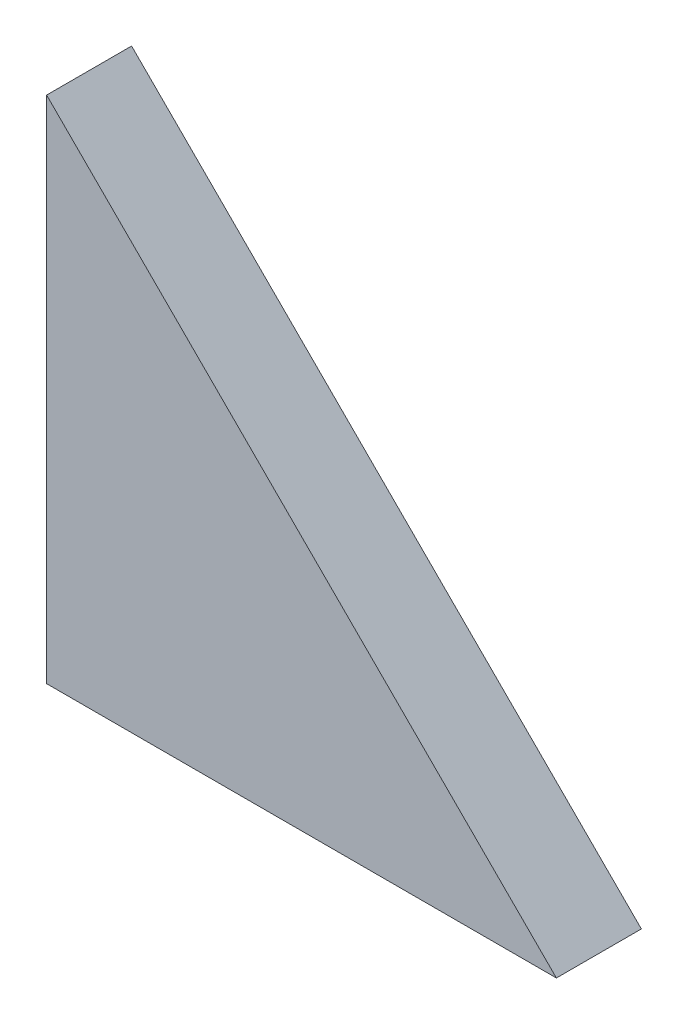
ISO-10303-21;
HEADER;
FILE_DESCRIPTION(('STEP AP214'),'2;1');
FILE_NAME('part.step','',(''),(''),'','','');
FILE_SCHEMA(('AUTOMOTIVE_DESIGN { 1 0 10303 214 1 1 1 1 }'));
ENDSEC;
DATA;
#1=APPLICATION_CONTEXT('core data for automotive mechanical design processes');
#2=APPLICATION_PROTOCOL_DEFINITION('international standard','automotive_design',2000,#1);
#3=PRODUCT_CONTEXT('',#1,'mechanical');
#4=PRODUCT('Part','Part','',(#3));
#5=PRODUCT_RELATED_PRODUCT_CATEGORY('part','',(#4));
#6=PRODUCT_DEFINITION_FORMATION('','',#4);
#7=PRODUCT_DEFINITION_CONTEXT('part definition',#1,'design');
#8=PRODUCT_DEFINITION('design','',#6,#7);
#9=PRODUCT_DEFINITION_SHAPE('','',#8);
#10=(LENGTH_UNIT() NAMED_UNIT(*) SI_UNIT(.MILLI.,.METRE.));
#11=(NAMED_UNIT(*) PLANE_ANGLE_UNIT() SI_UNIT($,.RADIAN.));
#12=(NAMED_UNIT(*) SI_UNIT($,.STERADIAN.) SOLID_ANGLE_UNIT());
#13=UNCERTAINTY_MEASURE_WITH_UNIT(LENGTH_MEASURE(1.E-05),#10,'distance_accuracy_value','');
#14=(GEOMETRIC_REPRESENTATION_CONTEXT(3) GLOBAL_UNCERTAINTY_ASSIGNED_CONTEXT((#13)) GLOBAL_UNIT_ASSIGNED_CONTEXT((#10,
#11,#12)) REPRESENTATION_CONTEXT('',''));
#15=CARTESIAN_POINT('',(0.,0.,0.));
#16=DIRECTION('',(0.,0.,1.));
#17=DIRECTION('',(1.,0.,0.));
#18=AXIS2_PLACEMENT_3D('',#15,#16,#17);
#19=CARTESIAN_POINT('',(0.,0.,10.));
#20=DIRECTION('',(1.,0.,0.));
#21=DIRECTION('',(0.,0.,-1.));
#22=AXIS2_PLACEMENT_3D('',#19,#20,#21);
#23=PLANE('',#22);
#24=DIRECTION('',(0.,-1.,0.));
#25=VECTOR('',#24,1.);
#26=CARTESIAN_POINT('',(0.,0.,0.));
#27=LINE('',#26,#25);
#28=CARTESIAN_POINT('',(0.,60.,0.));
#29=VERTEX_POINT('',#28);
#30=CARTESIAN_POINT('',(0.,0.,0.));
#31=VERTEX_POINT('',#30);
#32=EDGE_CURVE('E83',#29,#31,#27,.T.);
#33=ORIENTED_EDGE('',*,*,#32,.T.);
#34=DIRECTION('',(0.,0.,-1.));
#35=VECTOR('',#34,1.);
#36=CARTESIAN_POINT('',(0.,0.,10.));
#37=LINE('',#36,#35);
#38=CARTESIAN_POINT('',(0.,0.,10.));
#39=VERTEX_POINT('',#38);
#40=EDGE_CURVE('E11',#39,#31,#37,.T.);
#41=ORIENTED_EDGE('',*,*,#40,.F.);
#42=DIRECTION('',(0.,-1.,0.));
#43=VECTOR('',#42,1.);
#44=CARTESIAN_POINT('',(0.,0.,10.));
#45=LINE('',#44,#43);
#46=CARTESIAN_POINT('',(0.,60.,10.));
#47=VERTEX_POINT('',#46);
#48=EDGE_CURVE('E76',#47,#39,#45,.T.);
#49=ORIENTED_EDGE('',*,*,#48,.F.);
#50=DIRECTION('',(0.,0.,-1.));
#51=VECTOR('',#50,1.);
#52=CARTESIAN_POINT('',(0.,60.,10.));
#53=LINE('',#52,#51);
#54=EDGE_CURVE('E84',#47,#29,#53,.T.);
#55=ORIENTED_EDGE('',*,*,#54,.T.);
#56=EDGE_LOOP('',(#33,#41,#49,#55));
#57=FACE_BOUND('',#56,.T.);
#58=ADVANCED_FACE('F36',(#57),#23,.F.);
#59=CARTESIAN_POINT('',(0.,0.,10.));
#60=DIRECTION('',(0.,1.,0.));
#61=DIRECTION('',(0.,0.,1.));
#62=AXIS2_PLACEMENT_3D('',#59,#60,#61);
#63=PLANE('',#62);
#64=DIRECTION('',(1.,0.,0.));
#65=VECTOR('',#64,1.);
#66=CARTESIAN_POINT('',(0.,0.,0.));
#67=LINE('',#66,#65);
#68=CARTESIAN_POINT('',(60.,0.,0.));
#69=VERTEX_POINT('',#68);
#70=EDGE_CURVE('E64',#31,#69,#67,.T.);
#71=ORIENTED_EDGE('',*,*,#70,.T.);
#72=DIRECTION('',(0.,0.,-1.));
#73=VECTOR('',#72,1.);
#74=CARTESIAN_POINT('',(60.,0.,10.));
#75=LINE('',#74,#73);
#76=CARTESIAN_POINT('',(60.,0.,10.));
#77=VERTEX_POINT('',#76);
#78=EDGE_CURVE('E44',#77,#69,#75,.T.);
#79=ORIENTED_EDGE('',*,*,#78,.F.);
#80=DIRECTION('',(1.,0.,0.));
#81=VECTOR('',#80,1.);
#82=CARTESIAN_POINT('',(0.,0.,10.));
#83=LINE('',#82,#81);
#84=EDGE_CURVE('E72',#39,#77,#83,.T.);
#85=ORIENTED_EDGE('',*,*,#84,.F.);
#86=ORIENTED_EDGE('',*,*,#40,.T.);
#87=EDGE_LOOP('',(#71,#79,#85,#86));
#88=FACE_BOUND('',#87,.T.);
#89=ADVANCED_FACE('F73',(#88),#63,.F.);
#90=CARTESIAN_POINT('',(0.,60.,10.));
#91=DIRECTION('',(-0.707106781186548,-0.707106781186548,0.));
#92=DIRECTION('',(0.707106781186548,-0.707106781186548,0.));
#93=AXIS2_PLACEMENT_3D('',#90,#91,#92);
#94=PLANE('',#93);
#95=DIRECTION('',(-0.707106781186547,0.707106781186547,0.));
#96=VECTOR('',#95,1.);
#97=CARTESIAN_POINT('',(0.,60.,0.));
#98=LINE('',#97,#96);
#99=EDGE_CURVE('E69',#69,#29,#98,.T.);
#100=ORIENTED_EDGE('',*,*,#99,.T.);
#101=ORIENTED_EDGE('',*,*,#54,.F.);
#102=DIRECTION('',(-0.707106781186547,0.707106781186547,0.));
#103=VECTOR('',#102,1.);
#104=CARTESIAN_POINT('',(0.,60.,10.));
#105=LINE('',#104,#103);
#106=EDGE_CURVE('E52',#77,#47,#105,.T.);
#107=ORIENTED_EDGE('',*,*,#106,.F.);
#108=ORIENTED_EDGE('',*,*,#78,.T.);
#109=EDGE_LOOP('',(#100,#101,#107,#108));
#110=FACE_BOUND('',#109,.T.);
#111=ADVANCED_FACE('F91',(#110),#94,.F.);
#112=CARTESIAN_POINT('',(0.,0.,10.));
#113=DIRECTION('',(0.,0.,-1.));
#114=DIRECTION('',(-1.,0.,0.));
#115=AXIS2_PLACEMENT_3D('',#112,#113,#114);
#116=PLANE('',#115);
#117=ORIENTED_EDGE('',*,*,#48,.T.);
#118=ORIENTED_EDGE('',*,*,#84,.T.);
#119=ORIENTED_EDGE('',*,*,#106,.T.);
#120=EDGE_LOOP('',(#117,#118,#119));
#121=FACE_BOUND('',#120,.T.);
#122=ADVANCED_FACE('F79',(#121),#116,.F.);
#123=CARTESIAN_POINT('',(0.,0.,0.));
#124=DIRECTION('',(0.,0.,-1.));
#125=DIRECTION('',(-1.,0.,0.));
#126=AXIS2_PLACEMENT_3D('',#123,#124,#125);
#127=PLANE('',#126);
#128=ORIENTED_EDGE('',*,*,#32,.F.);
#129=ORIENTED_EDGE('',*,*,#99,.F.);
#130=ORIENTED_EDGE('',*,*,#70,.F.);
#131=EDGE_LOOP('',(#128,#129,#130));
#132=FACE_BOUND('',#131,.T.);
#133=ADVANCED_FACE('F92',(#132),#127,.T.);
#134=CLOSED_SHELL('',(#58,#89,#111,#122,#133));
#135=MANIFOLD_SOLID_BREP('B2',#134);
#136=ADVANCED_BREP_SHAPE_REPRESENTATION('',(#18,#135),#14);
#137=SHAPE_DEFINITION_REPRESENTATION(#9,#136);
ENDSEC;
END-ISO-10303-21;
